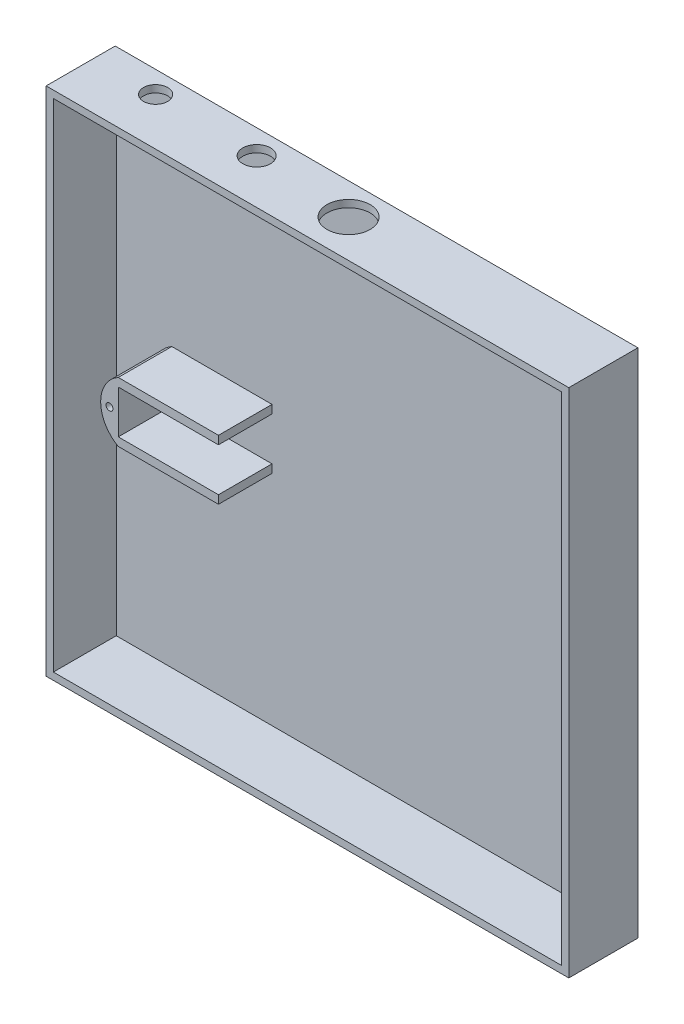
ISO-10303-21;
HEADER;
FILE_DESCRIPTION(('STEP AP214'),'2;1');
FILE_NAME('part.step','',(''),(''),'','','');
FILE_SCHEMA(('AUTOMOTIVE_DESIGN { 1 0 10303 214 1 1 1 1 }'));
ENDSEC;
DATA;
#1=APPLICATION_CONTEXT('core data for automotive mechanical design processes');
#2=APPLICATION_PROTOCOL_DEFINITION('international standard','automotive_design',2000,#1);
#3=PRODUCT_CONTEXT('',#1,'mechanical');
#4=PRODUCT('Part','Part','',(#3));
#5=PRODUCT_RELATED_PRODUCT_CATEGORY('part','',(#4));
#6=PRODUCT_DEFINITION_FORMATION('','',#4);
#7=PRODUCT_DEFINITION_CONTEXT('part definition',#1,'design');
#8=PRODUCT_DEFINITION('design','',#6,#7);
#9=PRODUCT_DEFINITION_SHAPE('','',#8);
#10=(LENGTH_UNIT() NAMED_UNIT(*) SI_UNIT(.MILLI.,.METRE.));
#11=(NAMED_UNIT(*) PLANE_ANGLE_UNIT() SI_UNIT($,.RADIAN.));
#12=(NAMED_UNIT(*) SI_UNIT($,.STERADIAN.) SOLID_ANGLE_UNIT());
#13=UNCERTAINTY_MEASURE_WITH_UNIT(LENGTH_MEASURE(1.E-05),#10,'distance_accuracy_value','');
#14=(GEOMETRIC_REPRESENTATION_CONTEXT(3) GLOBAL_UNCERTAINTY_ASSIGNED_CONTEXT((#13)) GLOBAL_UNIT_ASSIGNED_CONTEXT((#10,
#11,#12)) REPRESENTATION_CONTEXT('',''));
#15=CARTESIAN_POINT('',(0.,0.,0.));
#16=DIRECTION('',(0.,0.,1.));
#17=DIRECTION('',(1.,0.,0.));
#18=AXIS2_PLACEMENT_3D('',#15,#16,#17);
#19=CARTESIAN_POINT('',(-181.132201909092,61.0983981693364,1.8));
#20=DIRECTION('',(1.,0.,0.));
#21=DIRECTION('',(0.,0.,-1.));
#22=AXIS2_PLACEMENT_3D('',#19,#20,#21);
#23=PLANE('',#22);
#24=DIRECTION('',(0.,-1.,0.));
#25=VECTOR('',#24,1.);
#26=CARTESIAN_POINT('',(-181.132201909092,61.0983981693364,0.));
#27=LINE('',#26,#25);
#28=CARTESIAN_POINT('',(-181.132201909092,61.0983981693364,0.));
#29=VERTEX_POINT('',#28);
#30=CARTESIAN_POINT('',(-181.132201909092,-86.9016018306636,0.));
#31=VERTEX_POINT('',#30);
#32=EDGE_CURVE('E234',#29,#31,#27,.T.);
#33=ORIENTED_EDGE('',*,*,#32,.T.);
#34=DIRECTION('',(0.,0.,-1.));
#35=VECTOR('',#34,1.);
#36=CARTESIAN_POINT('',(-181.132201909092,-86.9016018306636,1.8));
#37=LINE('',#36,#35);
#38=CARTESIAN_POINT('',(-181.132201909092,-86.9016018306636,20.));
#39=VERTEX_POINT('',#38);
#40=EDGE_CURVE('E40',#39,#31,#37,.T.);
#41=ORIENTED_EDGE('',*,*,#40,.F.);
#42=DIRECTION('',(0.,-1.,0.));
#43=VECTOR('',#42,1.);
#44=CARTESIAN_POINT('',(-181.132201909092,61.0983981693364,20.));
#45=LINE('',#44,#43);
#46=CARTESIAN_POINT('',(-181.132201909092,61.0983981693364,20.));
#47=VERTEX_POINT('',#46);
#48=EDGE_CURVE('E222',#47,#39,#45,.T.);
#49=ORIENTED_EDGE('',*,*,#48,.F.);
#50=DIRECTION('',(0.,0.,-1.));
#51=VECTOR('',#50,1.);
#52=CARTESIAN_POINT('',(-181.132201909092,61.0983981693364,1.8));
#53=LINE('',#52,#51);
#54=EDGE_CURVE('E243',#47,#29,#53,.T.);
#55=ORIENTED_EDGE('',*,*,#54,.T.);
#56=EDGE_LOOP('',(#33,#41,#49,#55));
#57=FACE_BOUND('',#56,.T.);
#58=ADVANCED_FACE('F33',(#57),#23,.F.);
#59=CARTESIAN_POINT('',(-181.132201909092,-86.9016018306636,1.8));
#60=DIRECTION('',(0.,1.,0.));
#61=DIRECTION('',(0.,0.,1.));
#62=AXIS2_PLACEMENT_3D('',#59,#60,#61);
#63=PLANE('',#62);
#64=DIRECTION('',(1.,0.,0.));
#65=VECTOR('',#64,1.);
#66=CARTESIAN_POINT('',(-181.132201909092,-86.9016018306636,0.));
#67=LINE('',#66,#65);
#68=CARTESIAN_POINT('',(-29.8322019090922,-86.9016018306636,0.));
#69=VERTEX_POINT('',#68);
#70=EDGE_CURVE('E237',#31,#69,#67,.T.);
#71=ORIENTED_EDGE('',*,*,#70,.T.);
#72=DIRECTION('',(0.,0.,-1.));
#73=VECTOR('',#72,1.);
#74=CARTESIAN_POINT('',(-29.8322019090922,-86.9016018306636,1.8));
#75=LINE('',#74,#73);
#76=CARTESIAN_POINT('',(-29.8322019090922,-86.9016018306636,20.));
#77=VERTEX_POINT('',#76);
#78=EDGE_CURVE('E249',#77,#69,#75,.T.);
#79=ORIENTED_EDGE('',*,*,#78,.F.);
#80=DIRECTION('',(1.,0.,0.));
#81=VECTOR('',#80,1.);
#82=CARTESIAN_POINT('',(-181.132201909092,-86.9016018306636,20.));
#83=LINE('',#82,#81);
#84=EDGE_CURVE('E225',#39,#77,#83,.T.);
#85=ORIENTED_EDGE('',*,*,#84,.F.);
#86=ORIENTED_EDGE('',*,*,#40,.T.);
#87=EDGE_LOOP('',(#71,#79,#85,#86));
#88=FACE_BOUND('',#87,.T.);
#89=ADVANCED_FACE('F254',(#88),#63,.F.);
#90=CARTESIAN_POINT('',(-29.8322019090922,61.0983981693364,1.8));
#91=DIRECTION('',(-1.,0.,0.));
#92=DIRECTION('',(0.,-1.,0.));
#93=AXIS2_PLACEMENT_3D('',#90,#91,#92);
#94=PLANE('',#93);
#95=DIRECTION('',(0.,1.,0.));
#96=VECTOR('',#95,1.);
#97=CARTESIAN_POINT('',(-29.8322019090922,61.0983981693364,0.));
#98=LINE('',#97,#96);
#99=CARTESIAN_POINT('',(-29.8322019090922,61.0983981693364,0.));
#100=VERTEX_POINT('',#99);
#101=EDGE_CURVE('E239',#69,#100,#98,.T.);
#102=ORIENTED_EDGE('',*,*,#101,.T.);
#103=DIRECTION('',(0.,0.,-1.));
#104=VECTOR('',#103,1.);
#105=CARTESIAN_POINT('',(-29.8322019090922,61.0983981693364,1.8));
#106=LINE('',#105,#104);
#107=CARTESIAN_POINT('',(-29.8322019090922,61.0983981693364,20.));
#108=VERTEX_POINT('',#107);
#109=EDGE_CURVE('E246',#108,#100,#106,.T.);
#110=ORIENTED_EDGE('',*,*,#109,.F.);
#111=DIRECTION('',(0.,1.,0.));
#112=VECTOR('',#111,1.);
#113=CARTESIAN_POINT('',(-29.8322019090922,61.0983981693364,20.));
#114=LINE('',#113,#112);
#115=EDGE_CURVE('E228',#77,#108,#114,.T.);
#116=ORIENTED_EDGE('',*,*,#115,.F.);
#117=ORIENTED_EDGE('',*,*,#78,.T.);
#118=EDGE_LOOP('',(#102,#110,#116,#117));
#119=FACE_BOUND('',#118,.T.);
#120=ADVANCED_FACE('F263',(#119),#94,.F.);
#121=CARTESIAN_POINT('',(-181.132201909092,61.0983981693364,1.8));
#122=DIRECTION('',(0.,-1.,0.));
#123=DIRECTION('',(0.,0.,-1.));
#124=AXIS2_PLACEMENT_3D('',#121,#122,#123);
#125=PLANE('',#124);
#126=CARTESIAN_POINT('',(-104.482201909092,61.0983981693364,9.1));
#127=DIRECTION('',(0.,1.,0.));
#128=DIRECTION('',(0.,0.,1.));
#129=AXIS2_PLACEMENT_3D('',#126,#127,#128);
#130=CIRCLE('',#129,6.25);
#131=CARTESIAN_POINT('',(-104.482201909092,61.0983981693364,15.35));
#132=VERTEX_POINT('',#131);
#133=EDGE_CURVE('E183',#132,#132,#130,.T.);
#134=ORIENTED_EDGE('',*,*,#133,.F.);
#135=EDGE_LOOP('',(#134));
#136=FACE_BOUND('',#135,.T.);
#137=CARTESIAN_POINT('',(-163.132201909092,61.0983981693364,6.3));
#138=DIRECTION('',(0.,1.,0.));
#139=DIRECTION('',(0.,0.,1.));
#140=AXIS2_PLACEMENT_3D('',#137,#138,#139);
#141=CIRCLE('',#140,3.49999999999999);
#142=CARTESIAN_POINT('',(-163.132201909092,61.0983981693364,9.79999999999999));
#143=VERTEX_POINT('',#142);
#144=EDGE_CURVE('E189',#143,#143,#141,.T.);
#145=ORIENTED_EDGE('',*,*,#144,.F.);
#146=EDGE_LOOP('',(#145));
#147=FACE_BOUND('',#146,.T.);
#148=CARTESIAN_POINT('',(-133.132201909092,61.0983981693364,7.05));
#149=DIRECTION('',(0.,1.,0.));
#150=DIRECTION('',(0.,0.,1.));
#151=AXIS2_PLACEMENT_3D('',#148,#149,#150);
#152=CIRCLE('',#151,3.99999999999999);
#153=CARTESIAN_POINT('',(-133.132201909092,61.0983981693364,11.05));
#154=VERTEX_POINT('',#153);
#155=EDGE_CURVE('E171',#154,#154,#152,.T.);
#156=ORIENTED_EDGE('',*,*,#155,.F.);
#157=EDGE_LOOP('',(#156));
#158=FACE_BOUND('',#157,.T.);
#159=DIRECTION('',(-1.,0.,0.));
#160=VECTOR('',#159,1.);
#161=CARTESIAN_POINT('',(-181.132201909092,61.0983981693364,0.));
#162=LINE('',#161,#160);
#163=EDGE_CURVE('E241',#100,#29,#162,.T.);
#164=ORIENTED_EDGE('',*,*,#163,.T.);
#165=ORIENTED_EDGE('',*,*,#54,.F.);
#166=DIRECTION('',(-1.,0.,0.));
#167=VECTOR('',#166,1.);
#168=CARTESIAN_POINT('',(-181.132201909092,61.0983981693364,20.));
#169=LINE('',#168,#167);
#170=EDGE_CURVE('E231',#108,#47,#169,.T.);
#171=ORIENTED_EDGE('',*,*,#170,.F.);
#172=ORIENTED_EDGE('',*,*,#109,.T.);
#173=EDGE_LOOP('',(#164,#165,#171,#172));
#174=FACE_BOUND('',#173,.T.);
#175=ADVANCED_FACE('F267',(#136,#147,#158,#174),#125,.F.);
#176=CARTESIAN_POINT('',(0.,0.,0.));
#177=DIRECTION('',(0.,0.,1.));
#178=DIRECTION('',(1.,0.,0.));
#179=AXIS2_PLACEMENT_3D('',#176,#177,#178);
#180=PLANE('',#179);
#181=ORIENTED_EDGE('',*,*,#32,.F.);
#182=ORIENTED_EDGE('',*,*,#163,.F.);
#183=ORIENTED_EDGE('',*,*,#101,.F.);
#184=ORIENTED_EDGE('',*,*,#70,.F.);
#185=EDGE_LOOP('',(#181,#182,#183,#184));
#186=FACE_BOUND('',#185,.T.);
#187=ADVANCED_FACE('F260',(#186),#180,.F.);
#188=CARTESIAN_POINT('',(0.,0.,20.));
#189=DIRECTION('',(0.,0.,1.));
#190=DIRECTION('',(1.,0.,0.));
#191=AXIS2_PLACEMENT_3D('',#188,#189,#190);
#192=PLANE('',#191);
#193=ORIENTED_EDGE('',*,*,#48,.T.);
#194=ORIENTED_EDGE('',*,*,#84,.T.);
#195=ORIENTED_EDGE('',*,*,#115,.T.);
#196=ORIENTED_EDGE('',*,*,#170,.T.);
#197=EDGE_LOOP('',(#193,#194,#195,#196));
#198=FACE_BOUND('',#197,.T.);
#199=DIRECTION('',(1.,0.,0.));
#200=VECTOR('',#199,1.);
#201=CARTESIAN_POINT('',(-179.032201909092,-84.8016018306636,20.));
#202=LINE('',#201,#200);
#203=CARTESIAN_POINT('',(-179.032201909092,-84.8016018306636,20.));
#204=VERTEX_POINT('',#203);
#205=CARTESIAN_POINT('',(-31.9322019090922,-84.8016018306636,20.));
#206=VERTEX_POINT('',#205);
#207=EDGE_CURVE('E196',#204,#206,#202,.T.);
#208=ORIENTED_EDGE('',*,*,#207,.F.);
#209=DIRECTION('',(0.,-1.,0.));
#210=VECTOR('',#209,1.);
#211=CARTESIAN_POINT('',(-179.032201909092,58.9983981693364,20.));
#212=LINE('',#211,#210);
#213=CARTESIAN_POINT('',(-179.032201909092,58.9983981693364,20.));
#214=VERTEX_POINT('',#213);
#215=EDGE_CURVE('E194',#214,#204,#212,.T.);
#216=ORIENTED_EDGE('',*,*,#215,.F.);
#217=DIRECTION('',(-1.,0.,0.));
#218=VECTOR('',#217,1.);
#219=CARTESIAN_POINT('',(-179.032201909092,58.9983981693364,20.));
#220=LINE('',#219,#218);
#221=CARTESIAN_POINT('',(-31.9322019090922,58.9983981693364,20.));
#222=VERTEX_POINT('',#221);
#223=EDGE_CURVE('E202',#222,#214,#220,.T.);
#224=ORIENTED_EDGE('',*,*,#223,.F.);
#225=DIRECTION('',(0.,1.,0.));
#226=VECTOR('',#225,1.);
#227=CARTESIAN_POINT('',(-31.9322019090922,58.9983981693364,20.));
#228=LINE('',#227,#226);
#229=EDGE_CURVE('E199',#206,#222,#228,.T.);
#230=ORIENTED_EDGE('',*,*,#229,.F.);
#231=EDGE_LOOP('',(#208,#216,#224,#230));
#232=FACE_BOUND('',#231,.T.);
#233=ADVANCED_FACE('F269',(#198,#232),#192,.T.);
#234=CARTESIAN_POINT('',(-179.032201909092,58.9983981693364,20.));
#235=DIRECTION('',(1.,0.,0.));
#236=DIRECTION('',(0.,1.,0.));
#237=AXIS2_PLACEMENT_3D('',#234,#235,#236);
#238=PLANE('',#237);
#239=DIRECTION('',(0.,-1.,0.));
#240=VECTOR('',#239,1.);
#241=CARTESIAN_POINT('',(-179.032201909092,58.9983981693364,1.8));
#242=LINE('',#241,#240);
#243=CARTESIAN_POINT('',(-179.032201909092,58.9983981693364,1.8));
#244=VERTEX_POINT('',#243);
#245=CARTESIAN_POINT('',(-179.032201909092,-84.8016018306636,1.8));
#246=VERTEX_POINT('',#245);
#247=EDGE_CURVE('E55',#244,#246,#242,.T.);
#248=ORIENTED_EDGE('',*,*,#247,.F.);
#249=DIRECTION('',(0.,0.,-1.));
#250=VECTOR('',#249,1.);
#251=CARTESIAN_POINT('',(-179.032201909092,58.9983981693364,20.));
#252=LINE('',#251,#250);
#253=EDGE_CURVE('E204',#214,#244,#252,.T.);
#254=ORIENTED_EDGE('',*,*,#253,.F.);
#255=ORIENTED_EDGE('',*,*,#215,.T.);
#256=DIRECTION('',(0.,0.,-1.));
#257=VECTOR('',#256,1.);
#258=CARTESIAN_POINT('',(-179.032201909092,-84.8016018306636,20.));
#259=LINE('',#258,#257);
#260=EDGE_CURVE('E219',#204,#246,#259,.T.);
#261=ORIENTED_EDGE('',*,*,#260,.T.);
#262=EDGE_LOOP('',(#248,#254,#255,#261));
#263=FACE_BOUND('',#262,.T.);
#264=ADVANCED_FACE('F272',(#263),#238,.T.);
#265=CARTESIAN_POINT('',(-179.032201909092,-84.8016018306636,20.));
#266=DIRECTION('',(0.,1.,0.));
#267=DIRECTION('',(-1.,0.,0.));
#268=AXIS2_PLACEMENT_3D('',#265,#266,#267);
#269=PLANE('',#268);
#270=DIRECTION('',(1.,0.,0.));
#271=VECTOR('',#270,1.);
#272=CARTESIAN_POINT('',(-179.032201909092,-84.8016018306636,1.8));
#273=LINE('',#272,#271);
#274=CARTESIAN_POINT('',(-31.9322019090922,-84.8016018306636,1.8));
#275=VERTEX_POINT('',#274);
#276=EDGE_CURVE('E206',#246,#275,#273,.T.);
#277=ORIENTED_EDGE('',*,*,#276,.F.);
#278=ORIENTED_EDGE('',*,*,#260,.F.);
#279=ORIENTED_EDGE('',*,*,#207,.T.);
#280=DIRECTION('',(0.,0.,-1.));
#281=VECTOR('',#280,1.);
#282=CARTESIAN_POINT('',(-31.9322019090922,-84.8016018306636,20.));
#283=LINE('',#282,#281);
#284=EDGE_CURVE('E216',#206,#275,#283,.T.);
#285=ORIENTED_EDGE('',*,*,#284,.T.);
#286=EDGE_LOOP('',(#277,#278,#279,#285));
#287=FACE_BOUND('',#286,.T.);
#288=ADVANCED_FACE('F281',(#287),#269,.T.);
#289=CARTESIAN_POINT('',(-31.9322019090922,58.9983981693364,20.));
#290=DIRECTION('',(-1.,0.,0.));
#291=DIRECTION('',(0.,-1.,0.));
#292=AXIS2_PLACEMENT_3D('',#289,#290,#291);
#293=PLANE('',#292);
#294=DIRECTION('',(0.,1.,0.));
#295=VECTOR('',#294,1.);
#296=CARTESIAN_POINT('',(-31.9322019090922,58.9983981693364,1.8));
#297=LINE('',#296,#295);
#298=CARTESIAN_POINT('',(-31.9322019090922,58.9983981693364,1.8));
#299=VERTEX_POINT('',#298);
#300=EDGE_CURVE('E208',#275,#299,#297,.T.);
#301=ORIENTED_EDGE('',*,*,#300,.F.);
#302=ORIENTED_EDGE('',*,*,#284,.F.);
#303=ORIENTED_EDGE('',*,*,#229,.T.);
#304=DIRECTION('',(0.,0.,-1.));
#305=VECTOR('',#304,1.);
#306=CARTESIAN_POINT('',(-31.9322019090922,58.9983981693364,20.));
#307=LINE('',#306,#305);
#308=EDGE_CURVE('E213',#222,#299,#307,.T.);
#309=ORIENTED_EDGE('',*,*,#308,.T.);
#310=EDGE_LOOP('',(#301,#302,#303,#309));
#311=FACE_BOUND('',#310,.T.);
#312=ADVANCED_FACE('F284',(#311),#293,.T.);
#313=CARTESIAN_POINT('',(-179.032201909092,58.9983981693364,20.));
#314=DIRECTION('',(0.,-1.,0.));
#315=DIRECTION('',(0.,0.,-1.));
#316=AXIS2_PLACEMENT_3D('',#313,#314,#315);
#317=PLANE('',#316);
#318=CARTESIAN_POINT('',(-104.482201909092,58.9983981693364,9.1));
#319=DIRECTION('',(0.,1.,0.));
#320=DIRECTION('',(0.,0.,1.));
#321=AXIS2_PLACEMENT_3D('',#318,#319,#320);
#322=CIRCLE('',#321,6.25);
#323=CARTESIAN_POINT('',(-104.482201909092,58.9983981693364,15.35));
#324=VERTEX_POINT('',#323);
#325=EDGE_CURVE('E180',#324,#324,#322,.T.);
#326=ORIENTED_EDGE('',*,*,#325,.T.);
#327=EDGE_LOOP('',(#326));
#328=FACE_BOUND('',#327,.T.);
#329=CARTESIAN_POINT('',(-163.132201909092,58.9983981693364,6.3));
#330=DIRECTION('',(0.,1.,0.));
#331=DIRECTION('',(0.,0.,1.));
#332=AXIS2_PLACEMENT_3D('',#329,#330,#331);
#333=CIRCLE('',#332,3.49999999999999);
#334=CARTESIAN_POINT('',(-163.132201909092,58.9983981693364,9.79999999999999));
#335=VERTEX_POINT('',#334);
#336=EDGE_CURVE('E186',#335,#335,#333,.T.);
#337=ORIENTED_EDGE('',*,*,#336,.T.);
#338=EDGE_LOOP('',(#337));
#339=FACE_BOUND('',#338,.T.);
#340=CARTESIAN_POINT('',(-133.132201909092,58.9983981693364,7.05));
#341=DIRECTION('',(0.,1.,0.));
#342=DIRECTION('',(0.,0.,1.));
#343=AXIS2_PLACEMENT_3D('',#340,#341,#342);
#344=CIRCLE('',#343,3.99999999999999);
#345=CARTESIAN_POINT('',(-133.132201909092,58.9983981693364,11.05));
#346=VERTEX_POINT('',#345);
#347=EDGE_CURVE('E174',#346,#346,#344,.T.);
#348=ORIENTED_EDGE('',*,*,#347,.T.);
#349=EDGE_LOOP('',(#348));
#350=FACE_BOUND('',#349,.T.);
#351=DIRECTION('',(-1.,0.,0.));
#352=VECTOR('',#351,1.);
#353=CARTESIAN_POINT('',(-179.032201909092,58.9983981693364,1.8));
#354=LINE('',#353,#352);
#355=EDGE_CURVE('E197',#299,#244,#354,.T.);
#356=ORIENTED_EDGE('',*,*,#355,.F.);
#357=ORIENTED_EDGE('',*,*,#308,.F.);
#358=ORIENTED_EDGE('',*,*,#223,.T.);
#359=ORIENTED_EDGE('',*,*,#253,.T.);
#360=EDGE_LOOP('',(#356,#357,#358,#359));
#361=FACE_BOUND('',#360,.T.);
#362=ADVANCED_FACE('F290',(#328,#339,#350,#361),#317,.T.);
#363=CARTESIAN_POINT('',(0.,0.,1.8));
#364=DIRECTION('',(0.,0.,1.));
#365=DIRECTION('',(1.,0.,0.));
#366=AXIS2_PLACEMENT_3D('',#363,#364,#365);
#367=PLANE('',#366);
#368=DIRECTION('',(1.,0.,0.));
#369=VECTOR('',#368,1.);
#370=CARTESIAN_POINT('',(-162.945141439807,-21.5516018306636,1.8));
#371=LINE('',#370,#369);
#372=CARTESIAN_POINT('',(-162.945141439807,-21.5516018306636,1.8));
#373=VERTEX_POINT('',#372);
#374=CARTESIAN_POINT('',(-133.945141439807,-21.5516018306636,1.8));
#375=VERTEX_POINT('',#374);
#376=EDGE_CURVE('E489',#373,#375,#371,.T.);
#377=ORIENTED_EDGE('',*,*,#376,.F.);
#378=CARTESIAN_POINT('',(-158.159602224121,-12.9016018306636,1.8));
#379=DIRECTION('',(0.,0.,1.));
#380=DIRECTION('',(1.,0.,0.));
#381=AXIS2_PLACEMENT_3D('',#378,#379,#380);
#382=CIRCLE('',#381,9.88553921568629);
#383=CARTESIAN_POINT('',(-162.945141439807,-4.25160183066362,1.8));
#384=VERTEX_POINT('',#383);
#385=EDGE_CURVE('E169',#384,#373,#382,.T.);
#386=ORIENTED_EDGE('',*,*,#385,.F.);
#387=DIRECTION('',(-1.,0.,0.));
#388=VECTOR('',#387,1.);
#389=CARTESIAN_POINT('',(-162.945141439807,-4.25160183066362,1.8));
#390=LINE('',#389,#388);
#391=CARTESIAN_POINT('',(-133.945141439807,-4.25160183066362,1.8));
#392=VERTEX_POINT('',#391);
#393=EDGE_CURVE('E165',#392,#384,#390,.T.);
#394=ORIENTED_EDGE('',*,*,#393,.F.);
#395=DIRECTION('',(0.,1.,0.));
#396=VECTOR('',#395,1.);
#397=CARTESIAN_POINT('',(-133.945141439807,-4.25160183066362,1.8));
#398=LINE('',#397,#396);
#399=CARTESIAN_POINT('',(-133.945141439807,-6.65160183066362,1.8));
#400=VERTEX_POINT('',#399);
#401=EDGE_CURVE('E512',#400,#392,#398,.T.);
#402=ORIENTED_EDGE('',*,*,#401,.F.);
#403=DIRECTION('',(1.,0.,0.));
#404=VECTOR('',#403,1.);
#405=CARTESIAN_POINT('',(-162.945141439807,-6.65160183066362,1.8));
#406=LINE('',#405,#404);
#407=CARTESIAN_POINT('',(-162.945141439807,-6.65160183066362,1.8));
#408=VERTEX_POINT('',#407);
#409=EDGE_CURVE('E510',#408,#400,#406,.T.);
#410=ORIENTED_EDGE('',*,*,#409,.F.);
#411=DIRECTION('',(0.,1.,0.));
#412=VECTOR('',#411,1.);
#413=CARTESIAN_POINT('',(-162.945141439807,-6.65160183066362,1.8));
#414=LINE('',#413,#412);
#415=CARTESIAN_POINT('',(-162.945141439807,-19.1516018306636,1.8));
#416=VERTEX_POINT('',#415);
#417=EDGE_CURVE('E508',#416,#408,#414,.T.);
#418=ORIENTED_EDGE('',*,*,#417,.F.);
#419=DIRECTION('',(-1.,0.,0.));
#420=VECTOR('',#419,1.);
#421=CARTESIAN_POINT('',(-162.945141439807,-19.1516018306636,1.8));
#422=LINE('',#421,#420);
#423=CARTESIAN_POINT('',(-133.945141439807,-19.1516018306636,1.8));
#424=VERTEX_POINT('',#423);
#425=EDGE_CURVE('E506',#424,#416,#422,.T.);
#426=ORIENTED_EDGE('',*,*,#425,.F.);
#427=DIRECTION('',(0.,1.,0.));
#428=VECTOR('',#427,1.);
#429=CARTESIAN_POINT('',(-133.945141439807,-19.1516018306636,1.8));
#430=LINE('',#429,#428);
#431=EDGE_CURVE('E504',#375,#424,#430,.T.);
#432=ORIENTED_EDGE('',*,*,#431,.F.);
#433=EDGE_LOOP('',(#377,#386,#394,#402,#410,#418,#426,#432));
#434=FACE_BOUND('',#433,.T.);
#435=ORIENTED_EDGE('',*,*,#247,.T.);
#436=ORIENTED_EDGE('',*,*,#276,.T.);
#437=ORIENTED_EDGE('',*,*,#300,.T.);
#438=ORIENTED_EDGE('',*,*,#355,.T.);
#439=EDGE_LOOP('',(#435,#436,#437,#438));
#440=FACE_BOUND('',#439,.T.);
#441=ADVANCED_FACE('F286',(#434,#440),#367,.T.);
#442=CARTESIAN_POINT('',(-133.132201909092,58.9983981693364,7.05));
#443=DIRECTION('',(0.,1.,0.));
#444=DIRECTION('',(0.,0.,1.));
#445=AXIS2_PLACEMENT_3D('',#442,#443,#444);
#446=CYLINDRICAL_SURFACE('',#445,3.99999999999999);
#447=ORIENTED_EDGE('',*,*,#347,.F.);
#448=EDGE_LOOP('',(#447));
#449=FACE_BOUND('',#448,.T.);
#450=ORIENTED_EDGE('',*,*,#155,.T.);
#451=EDGE_LOOP('',(#450));
#452=FACE_BOUND('',#451,.T.);
#453=ADVANCED_FACE('F298',(#449,#452),#446,.F.);
#454=CARTESIAN_POINT('',(-163.132201909092,58.9983981693364,6.3));
#455=DIRECTION('',(0.,1.,0.));
#456=DIRECTION('',(0.,0.,1.));
#457=AXIS2_PLACEMENT_3D('',#454,#455,#456);
#458=CYLINDRICAL_SURFACE('',#457,3.49999999999999);
#459=ORIENTED_EDGE('',*,*,#336,.F.);
#460=EDGE_LOOP('',(#459));
#461=FACE_BOUND('',#460,.T.);
#462=ORIENTED_EDGE('',*,*,#144,.T.);
#463=EDGE_LOOP('',(#462));
#464=FACE_BOUND('',#463,.T.);
#465=ADVANCED_FACE('F352',(#461,#464),#458,.F.);
#466=CARTESIAN_POINT('',(-104.482201909092,58.9983981693364,9.1));
#467=DIRECTION('',(0.,1.,0.));
#468=DIRECTION('',(0.,0.,1.));
#469=AXIS2_PLACEMENT_3D('',#466,#467,#468);
#470=CYLINDRICAL_SURFACE('',#469,6.25);
#471=ORIENTED_EDGE('',*,*,#325,.F.);
#472=EDGE_LOOP('',(#471));
#473=FACE_BOUND('',#472,.T.);
#474=ORIENTED_EDGE('',*,*,#133,.T.);
#475=EDGE_LOOP('',(#474));
#476=FACE_BOUND('',#475,.T.);
#477=ADVANCED_FACE('F361',(#473,#476),#470,.F.);
#478=CARTESIAN_POINT('',(-158.159602224121,-12.9016018306636,17.3));
#479=DIRECTION('',(0.,0.,1.));
#480=DIRECTION('',(1.,0.,0.));
#481=AXIS2_PLACEMENT_3D('',#478,#479,#480);
#482=PLANE('',#481);
#483=CARTESIAN_POINT('',(-158.159602224121,-12.9016018306636,17.3));
#484=DIRECTION('',(0.,0.,1.));
#485=DIRECTION('',(1.,0.,0.));
#486=AXIS2_PLACEMENT_3D('',#483,#484,#485);
#487=CIRCLE('',#486,9.88553921568629);
#488=CARTESIAN_POINT('',(-162.945141439807,-4.25160183066362,17.3));
#489=VERTEX_POINT('',#488);
#490=CARTESIAN_POINT('',(-162.945141439807,-21.5516018306636,17.3));
#491=VERTEX_POINT('',#490);
#492=EDGE_CURVE('E156',#489,#491,#487,.T.);
#493=ORIENTED_EDGE('',*,*,#492,.T.);
#494=DIRECTION('',(1.,0.,0.));
#495=VECTOR('',#494,1.);
#496=CARTESIAN_POINT('',(-162.945141439807,-21.5516018306636,17.3));
#497=LINE('',#496,#495);
#498=CARTESIAN_POINT('',(-133.945141439807,-21.5516018306636,17.3));
#499=VERTEX_POINT('',#498);
#500=EDGE_CURVE('E145',#491,#499,#497,.T.);
#501=ORIENTED_EDGE('',*,*,#500,.T.);
#502=DIRECTION('',(0.,1.,0.));
#503=VECTOR('',#502,1.);
#504=CARTESIAN_POINT('',(-133.945141439807,-19.1516018306636,17.3));
#505=LINE('',#504,#503);
#506=CARTESIAN_POINT('',(-133.945141439807,-19.1516018306636,17.3));
#507=VERTEX_POINT('',#506);
#508=EDGE_CURVE('E155',#499,#507,#505,.T.);
#509=ORIENTED_EDGE('',*,*,#508,.T.);
#510=DIRECTION('',(-1.,0.,0.));
#511=VECTOR('',#510,1.);
#512=CARTESIAN_POINT('',(-162.945141439807,-19.1516018306636,17.3));
#513=LINE('',#512,#511);
#514=CARTESIAN_POINT('',(-162.945141439807,-19.1516018306636,17.3));
#515=VERTEX_POINT('',#514);
#516=EDGE_CURVE('E493',#507,#515,#513,.T.);
#517=ORIENTED_EDGE('',*,*,#516,.T.);
#518=DIRECTION('',(0.,1.,0.));
#519=VECTOR('',#518,1.);
#520=CARTESIAN_POINT('',(-162.945141439807,-6.65160183066362,17.3));
#521=LINE('',#520,#519);
#522=CARTESIAN_POINT('',(-162.945141439807,-6.65160183066362,17.3));
#523=VERTEX_POINT('',#522);
#524=EDGE_CURVE('E495',#515,#523,#521,.T.);
#525=ORIENTED_EDGE('',*,*,#524,.T.);
#526=DIRECTION('',(1.,0.,0.));
#527=VECTOR('',#526,1.);
#528=CARTESIAN_POINT('',(-162.945141439807,-6.65160183066362,17.3));
#529=LINE('',#528,#527);
#530=CARTESIAN_POINT('',(-133.945141439807,-6.65160183066362,17.3));
#531=VERTEX_POINT('',#530);
#532=EDGE_CURVE('E497',#523,#531,#529,.T.);
#533=ORIENTED_EDGE('',*,*,#532,.T.);
#534=DIRECTION('',(0.,1.,0.));
#535=VECTOR('',#534,1.);
#536=CARTESIAN_POINT('',(-133.945141439807,-4.25160183066362,17.3));
#537=LINE('',#536,#535);
#538=CARTESIAN_POINT('',(-133.945141439807,-4.25160183066362,17.3));
#539=VERTEX_POINT('',#538);
#540=EDGE_CURVE('E499',#531,#539,#537,.T.);
#541=ORIENTED_EDGE('',*,*,#540,.T.);
#542=DIRECTION('',(-1.,0.,0.));
#543=VECTOR('',#542,1.);
#544=CARTESIAN_POINT('',(-162.945141439807,-4.25160183066362,17.3));
#545=LINE('',#544,#543);
#546=EDGE_CURVE('E161',#539,#489,#545,.T.);
#547=ORIENTED_EDGE('',*,*,#546,.T.);
#548=EDGE_LOOP('',(#493,#501,#509,#517,#525,#533,#541,#547));
#549=FACE_BOUND('',#548,.T.);
#550=CARTESIAN_POINT('',(-165.495141439807,-12.9016018306636,17.3));
#551=DIRECTION('',(0.,0.,1.));
#552=DIRECTION('',(1.,0.,0.));
#553=AXIS2_PLACEMENT_3D('',#550,#551,#552);
#554=CIRCLE('',#553,0.999999999999998);
#555=CARTESIAN_POINT('',(-164.495141439807,-12.9016018306636,17.3));
#556=VERTEX_POINT('',#555);
#557=EDGE_CURVE('E487',#556,#556,#554,.T.);
#558=ORIENTED_EDGE('',*,*,#557,.F.);
#559=EDGE_LOOP('',(#558));
#560=FACE_BOUND('',#559,.T.);
#561=ADVANCED_FACE('F159',(#549,#560),#482,.T.);
#562=CARTESIAN_POINT('',(-158.159602224121,-12.9016018306636,17.3));
#563=DIRECTION('',(0.,0.,-1.));
#564=DIRECTION('',(-1.,0.,0.));
#565=AXIS2_PLACEMENT_3D('',#562,#563,#564);
#566=CYLINDRICAL_SURFACE('',#565,9.88553921568629);
#567=ORIENTED_EDGE('',*,*,#385,.T.);
#568=DIRECTION('',(0.,0.,-1.));
#569=VECTOR('',#568,1.);
#570=CARTESIAN_POINT('',(-162.945141439807,-21.5516018306636,17.3));
#571=LINE('',#570,#569);
#572=EDGE_CURVE('E149',#491,#373,#571,.T.);
#573=ORIENTED_EDGE('',*,*,#572,.F.);
#574=ORIENTED_EDGE('',*,*,#492,.F.);
#575=DIRECTION('',(0.,0.,-1.));
#576=VECTOR('',#575,1.);
#577=CARTESIAN_POINT('',(-162.945141439807,-4.25160183066362,17.3));
#578=LINE('',#577,#576);
#579=EDGE_CURVE('E501',#489,#384,#578,.T.);
#580=ORIENTED_EDGE('',*,*,#579,.T.);
#581=EDGE_LOOP('',(#567,#573,#574,#580));
#582=FACE_BOUND('',#581,.T.);
#583=ADVANCED_FACE('F167',(#582),#566,.T.);
#584=CARTESIAN_POINT('',(-162.945141439807,-21.5516018306636,17.3));
#585=DIRECTION('',(0.,1.,0.));
#586=DIRECTION('',(0.,0.,1.));
#587=AXIS2_PLACEMENT_3D('',#584,#585,#586);
#588=PLANE('',#587);
#589=ORIENTED_EDGE('',*,*,#376,.T.);
#590=DIRECTION('',(0.,0.,-1.));
#591=VECTOR('',#590,1.);
#592=CARTESIAN_POINT('',(-133.945141439807,-21.5516018306636,17.3));
#593=LINE('',#592,#591);
#594=EDGE_CURVE('E152',#499,#375,#593,.T.);
#595=ORIENTED_EDGE('',*,*,#594,.F.);
#596=ORIENTED_EDGE('',*,*,#500,.F.);
#597=ORIENTED_EDGE('',*,*,#572,.T.);
#598=EDGE_LOOP('',(#589,#595,#596,#597));
#599=FACE_BOUND('',#598,.T.);
#600=ADVANCED_FACE('F147',(#599),#588,.F.);
#601=CARTESIAN_POINT('',(-133.945141439807,-19.1516018306636,17.3));
#602=DIRECTION('',(-1.,0.,0.));
#603=DIRECTION('',(0.,0.,1.));
#604=AXIS2_PLACEMENT_3D('',#601,#602,#603);
#605=PLANE('',#604);
#606=ORIENTED_EDGE('',*,*,#431,.T.);
#607=DIRECTION('',(0.,0.,-1.));
#608=VECTOR('',#607,1.);
#609=CARTESIAN_POINT('',(-133.945141439807,-19.1516018306636,17.3));
#610=LINE('',#609,#608);
#611=EDGE_CURVE('E176',#507,#424,#610,.T.);
#612=ORIENTED_EDGE('',*,*,#611,.F.);
#613=ORIENTED_EDGE('',*,*,#508,.F.);
#614=ORIENTED_EDGE('',*,*,#594,.T.);
#615=EDGE_LOOP('',(#606,#612,#613,#614));
#616=FACE_BOUND('',#615,.T.);
#617=ADVANCED_FACE('F404',(#616),#605,.F.);
#618=CARTESIAN_POINT('',(-162.945141439807,-19.1516018306636,17.3));
#619=DIRECTION('',(0.,-1.,0.));
#620=DIRECTION('',(0.,0.,-1.));
#621=AXIS2_PLACEMENT_3D('',#618,#619,#620);
#622=PLANE('',#621);
#623=ORIENTED_EDGE('',*,*,#425,.T.);
#624=DIRECTION('',(0.,0.,-1.));
#625=VECTOR('',#624,1.);
#626=CARTESIAN_POINT('',(-162.945141439807,-19.1516018306636,17.3));
#627=LINE('',#626,#625);
#628=EDGE_CURVE('E523',#515,#416,#627,.T.);
#629=ORIENTED_EDGE('',*,*,#628,.F.);
#630=ORIENTED_EDGE('',*,*,#516,.F.);
#631=ORIENTED_EDGE('',*,*,#611,.T.);
#632=EDGE_LOOP('',(#623,#629,#630,#631));
#633=FACE_BOUND('',#632,.T.);
#634=ADVANCED_FACE('F413',(#633),#622,.F.);
#635=CARTESIAN_POINT('',(-162.945141439807,-6.65160183066362,17.3));
#636=DIRECTION('',(-1.,0.,0.));
#637=DIRECTION('',(0.,0.,1.));
#638=AXIS2_PLACEMENT_3D('',#635,#636,#637);
#639=PLANE('',#638);
#640=ORIENTED_EDGE('',*,*,#417,.T.);
#641=DIRECTION('',(0.,0.,-1.));
#642=VECTOR('',#641,1.);
#643=CARTESIAN_POINT('',(-162.945141439807,-6.65160183066362,17.3));
#644=LINE('',#643,#642);
#645=EDGE_CURVE('E520',#523,#408,#644,.T.);
#646=ORIENTED_EDGE('',*,*,#645,.F.);
#647=ORIENTED_EDGE('',*,*,#524,.F.);
#648=ORIENTED_EDGE('',*,*,#628,.T.);
#649=EDGE_LOOP('',(#640,#646,#647,#648));
#650=FACE_BOUND('',#649,.T.);
#651=ADVANCED_FACE('F423',(#650),#639,.F.);
#652=CARTESIAN_POINT('',(-162.945141439807,-6.65160183066362,17.3));
#653=DIRECTION('',(0.,1.,0.));
#654=DIRECTION('',(0.,0.,1.));
#655=AXIS2_PLACEMENT_3D('',#652,#653,#654);
#656=PLANE('',#655);
#657=ORIENTED_EDGE('',*,*,#409,.T.);
#658=DIRECTION('',(0.,0.,-1.));
#659=VECTOR('',#658,1.);
#660=CARTESIAN_POINT('',(-133.945141439807,-6.65160183066362,17.3));
#661=LINE('',#660,#659);
#662=EDGE_CURVE('E517',#531,#400,#661,.T.);
#663=ORIENTED_EDGE('',*,*,#662,.F.);
#664=ORIENTED_EDGE('',*,*,#532,.F.);
#665=ORIENTED_EDGE('',*,*,#645,.T.);
#666=EDGE_LOOP('',(#657,#663,#664,#665));
#667=FACE_BOUND('',#666,.T.);
#668=ADVANCED_FACE('F433',(#667),#656,.F.);
#669=CARTESIAN_POINT('',(-133.945141439807,-4.25160183066362,17.3));
#670=DIRECTION('',(-1.,0.,0.));
#671=DIRECTION('',(0.,0.,1.));
#672=AXIS2_PLACEMENT_3D('',#669,#670,#671);
#673=PLANE('',#672);
#674=ORIENTED_EDGE('',*,*,#401,.T.);
#675=DIRECTION('',(0.,0.,-1.));
#676=VECTOR('',#675,1.);
#677=CARTESIAN_POINT('',(-133.945141439807,-4.25160183066362,17.3));
#678=LINE('',#677,#676);
#679=EDGE_CURVE('E47',#539,#392,#678,.T.);
#680=ORIENTED_EDGE('',*,*,#679,.F.);
#681=ORIENTED_EDGE('',*,*,#540,.F.);
#682=ORIENTED_EDGE('',*,*,#662,.T.);
#683=EDGE_LOOP('',(#674,#680,#681,#682));
#684=FACE_BOUND('',#683,.T.);
#685=ADVANCED_FACE('F443',(#684),#673,.F.);
#686=CARTESIAN_POINT('',(-162.945141439807,-4.25160183066362,17.3));
#687=DIRECTION('',(0.,-1.,0.));
#688=DIRECTION('',(1.,0.,0.));
#689=AXIS2_PLACEMENT_3D('',#686,#687,#688);
#690=PLANE('',#689);
#691=ORIENTED_EDGE('',*,*,#393,.T.);
#692=ORIENTED_EDGE('',*,*,#579,.F.);
#693=ORIENTED_EDGE('',*,*,#546,.F.);
#694=ORIENTED_EDGE('',*,*,#679,.T.);
#695=EDGE_LOOP('',(#691,#692,#693,#694));
#696=FACE_BOUND('',#695,.T.);
#697=ADVANCED_FACE('F453',(#696),#690,.F.);
#698=CARTESIAN_POINT('',(-165.495141439807,-12.9016018306636,17.3));
#699=DIRECTION('',(0.,0.,-1.));
#700=DIRECTION('',(-1.,0.,0.));
#701=AXIS2_PLACEMENT_3D('',#698,#699,#700);
#702=CYLINDRICAL_SURFACE('',#701,0.999999999999998);
#703=ORIENTED_EDGE('',*,*,#557,.T.);
#704=EDGE_LOOP('',(#703));
#705=FACE_BOUND('',#704,.T.);
#706=CARTESIAN_POINT('',(-165.495141439807,-12.9016018306636,1.8));
#707=DIRECTION('',(0.,0.,1.));
#708=DIRECTION('',(1.,0.,0.));
#709=AXIS2_PLACEMENT_3D('',#706,#707,#708);
#710=CIRCLE('',#709,0.999999999999998);
#711=CARTESIAN_POINT('',(-164.495141439807,-12.9016018306636,1.8));
#712=VERTEX_POINT('',#711);
#713=EDGE_CURVE('E11',#712,#712,#710,.F.);
#714=ORIENTED_EDGE('',*,*,#713,.T.);
#715=EDGE_LOOP('',(#714));
#716=FACE_BOUND('',#715,.T.);
#717=ADVANCED_FACE('F463',(#705,#716),#702,.F.);
#718=ORIENTED_EDGE('',*,*,#713,.F.);
#719=EDGE_LOOP('',(#718));
#720=FACE_BOUND('',#719,.T.);
#721=ADVANCED_FACE('F301',(#720),#367,.T.);
#722=CLOSED_SHELL('',(#58,#89,#120,#175,#187,#233,#264,#288,#312,#362,#441,#453,#465,#477,#561,
#583,#600,#617,#634,#651,#668,#685,#697,#717,#721));
#723=MANIFOLD_SOLID_BREP('B2',#722);
#724=ADVANCED_BREP_SHAPE_REPRESENTATION('',(#18,#723),#14);
#725=SHAPE_DEFINITION_REPRESENTATION(#9,#724);
ENDSEC;
END-ISO-10303-21;
